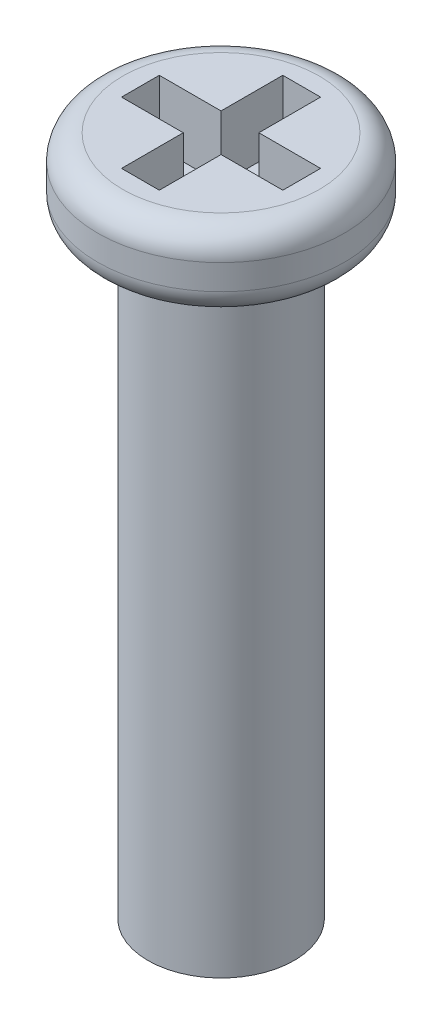
ISO-10303-21;
HEADER;
FILE_DESCRIPTION(('STEP AP214'),'2;1');
FILE_NAME('part.step','',(''),(''),'','','');
FILE_SCHEMA(('AUTOMOTIVE_DESIGN { 1 0 10303 214 1 1 1 1 }'));
ENDSEC;
DATA;
#1=APPLICATION_CONTEXT('core data for automotive mechanical design processes');
#2=APPLICATION_PROTOCOL_DEFINITION('international standard','automotive_design',2000,#1);
#3=PRODUCT_CONTEXT('',#1,'mechanical');
#4=PRODUCT('Part','Part','',(#3));
#5=PRODUCT_RELATED_PRODUCT_CATEGORY('part','',(#4));
#6=PRODUCT_DEFINITION_FORMATION('','',#4);
#7=PRODUCT_DEFINITION_CONTEXT('part definition',#1,'design');
#8=PRODUCT_DEFINITION('design','',#6,#7);
#9=PRODUCT_DEFINITION_SHAPE('','',#8);
#10=(LENGTH_UNIT() NAMED_UNIT(*) SI_UNIT(.MILLI.,.METRE.));
#11=(NAMED_UNIT(*) PLANE_ANGLE_UNIT() SI_UNIT($,.RADIAN.));
#12=(NAMED_UNIT(*) SI_UNIT($,.STERADIAN.) SOLID_ANGLE_UNIT());
#13=UNCERTAINTY_MEASURE_WITH_UNIT(LENGTH_MEASURE(1.E-05),#10,'distance_accuracy_value','');
#14=(GEOMETRIC_REPRESENTATION_CONTEXT(3) GLOBAL_UNCERTAINTY_ASSIGNED_CONTEXT((#13)) GLOBAL_UNIT_ASSIGNED_CONTEXT((#10,
#11,#12)) REPRESENTATION_CONTEXT('',''));
#15=CARTESIAN_POINT('',(0.,0.,0.));
#16=DIRECTION('',(0.,0.,1.));
#17=DIRECTION('',(1.,0.,0.));
#18=AXIS2_PLACEMENT_3D('',#15,#16,#17);
#19=CARTESIAN_POINT('',(0.,12.,0.));
#20=DIRECTION('',(0.,-1.,0.));
#21=DIRECTION('',(0.,0.,-1.));
#22=AXIS2_PLACEMENT_3D('',#19,#20,#21);
#23=CYLINDRICAL_SURFACE('',#22,1.45);
#24=CARTESIAN_POINT('',(0.,12.,0.));
#25=DIRECTION('',(0.,1.,0.));
#26=DIRECTION('',(0.,0.,1.));
#27=AXIS2_PLACEMENT_3D('',#24,#25,#26);
#28=CIRCLE('',#27,1.45);
#29=CARTESIAN_POINT('',(0.,12.,1.45));
#30=VERTEX_POINT('',#29);
#31=EDGE_CURVE('E178',#30,#30,#28,.T.);
#32=ORIENTED_EDGE('',*,*,#31,.F.);
#33=EDGE_LOOP('',(#32));
#34=FACE_BOUND('',#33,.T.);
#35=CARTESIAN_POINT('',(0.,0.,0.));
#36=DIRECTION('',(0.,1.,0.));
#37=DIRECTION('',(0.,0.,1.));
#38=AXIS2_PLACEMENT_3D('',#35,#36,#37);
#39=CIRCLE('',#38,1.45);
#40=CARTESIAN_POINT('',(0.,0.,1.45));
#41=VERTEX_POINT('',#40);
#42=EDGE_CURVE('E182',#41,#41,#39,.T.);
#43=ORIENTED_EDGE('',*,*,#42,.T.);
#44=EDGE_LOOP('',(#43));
#45=FACE_BOUND('',#44,.T.);
#46=ADVANCED_FACE('F32',(#34,#45),#23,.T.);
#47=CARTESIAN_POINT('',(0.,0.,0.));
#48=DIRECTION('',(0.,1.,0.));
#49=DIRECTION('',(0.,0.,1.));
#50=AXIS2_PLACEMENT_3D('',#47,#48,#49);
#51=PLANE('',#50);
#52=ORIENTED_EDGE('',*,*,#42,.F.);
#53=EDGE_LOOP('',(#52));
#54=FACE_BOUND('',#53,.T.);
#55=ADVANCED_FACE('F350',(#54),#51,.F.);
#56=CARTESIAN_POINT('',(0.,12.,0.));
#57=DIRECTION('',(0.,1.,0.));
#58=DIRECTION('',(0.,0.,1.));
#59=AXIS2_PLACEMENT_3D('',#56,#57,#58);
#60=PLANE('',#59);
#61=CARTESIAN_POINT('',(0.,12.,0.));
#62=DIRECTION('',(0.,1.,0.));
#63=DIRECTION('',(0.,0.,1.));
#64=AXIS2_PLACEMENT_3D('',#61,#62,#63);
#65=CIRCLE('',#64,1.95);
#66=CARTESIAN_POINT('',(0.,12.,1.95));
#67=VERTEX_POINT('',#66);
#68=EDGE_CURVE('E191',#67,#67,#65,.F.);
#69=ORIENTED_EDGE('',*,*,#68,.T.);
#70=EDGE_LOOP('',(#69));
#71=FACE_BOUND('',#70,.T.);
#72=ORIENTED_EDGE('',*,*,#31,.T.);
#73=EDGE_LOOP('',(#72));
#74=FACE_BOUND('',#73,.T.);
#75=ADVANCED_FACE('F356',(#71,#74),#60,.F.);
#76=CARTESIAN_POINT('',(0.,13.5,0.));
#77=DIRECTION('',(0.,-1.,0.));
#78=DIRECTION('',(0.,0.,-1.));
#79=AXIS2_PLACEMENT_3D('',#76,#77,#78);
#80=CYLINDRICAL_SURFACE('',#79,2.45);
#81=CARTESIAN_POINT('',(0.,12.5,0.));
#82=DIRECTION('',(0.,1.,0.));
#83=DIRECTION('',(0.,0.,1.));
#84=AXIS2_PLACEMENT_3D('',#81,#82,#83);
#85=CIRCLE('',#84,2.45);
#86=CARTESIAN_POINT('',(0.,12.5,2.45));
#87=VERTEX_POINT('',#86);
#88=EDGE_CURVE('E188',#87,#87,#85,.T.);
#89=ORIENTED_EDGE('',*,*,#88,.T.);
#90=EDGE_LOOP('',(#89));
#91=FACE_BOUND('',#90,.T.);
#92=CARTESIAN_POINT('',(0.,13.,0.));
#93=DIRECTION('',(0.,1.,0.));
#94=DIRECTION('',(0.,0.,1.));
#95=AXIS2_PLACEMENT_3D('',#92,#93,#94);
#96=CIRCLE('',#95,2.45);
#97=CARTESIAN_POINT('',(0.,13.,2.45));
#98=VERTEX_POINT('',#97);
#99=EDGE_CURVE('E181',#98,#98,#96,.F.);
#100=ORIENTED_EDGE('',*,*,#99,.T.);
#101=EDGE_LOOP('',(#100));
#102=FACE_BOUND('',#101,.T.);
#103=ADVANCED_FACE('F506',(#91,#102),#80,.T.);
#104=CARTESIAN_POINT('',(0.,13.5,0.));
#105=DIRECTION('',(0.,1.,0.));
#106=DIRECTION('',(0.,0.,1.));
#107=AXIS2_PLACEMENT_3D('',#104,#105,#106);
#108=PLANE('',#107);
#109=DIRECTION('',(0.,0.,1.));
#110=VECTOR('',#109,1.);
#111=CARTESIAN_POINT('',(-0.375,13.5,0.));
#112=LINE('',#111,#110);
#113=CARTESIAN_POINT('',(-0.375,13.5,-1.6));
#114=VERTEX_POINT('',#113);
#115=CARTESIAN_POINT('',(-0.375,13.5,-0.375));
#116=VERTEX_POINT('',#115);
#117=EDGE_CURVE('E168',#114,#116,#112,.T.);
#118=ORIENTED_EDGE('',*,*,#117,.F.);
#119=DIRECTION('',(1.,0.,0.));
#120=VECTOR('',#119,1.);
#121=CARTESIAN_POINT('',(0.,13.5,-1.6));
#122=LINE('',#121,#120);
#123=CARTESIAN_POINT('',(0.375,13.5,-1.6));
#124=VERTEX_POINT('',#123);
#125=EDGE_CURVE('E164',#114,#124,#122,.T.);
#126=ORIENTED_EDGE('',*,*,#125,.T.);
#127=DIRECTION('',(0.,0.,1.));
#128=VECTOR('',#127,1.);
#129=CARTESIAN_POINT('',(0.375,13.5,0.));
#130=LINE('',#129,#128);
#131=CARTESIAN_POINT('',(0.375,13.5,-0.375));
#132=VERTEX_POINT('',#131);
#133=EDGE_CURVE('E295',#124,#132,#130,.T.);
#134=ORIENTED_EDGE('',*,*,#133,.T.);
#135=DIRECTION('',(1.,0.,0.));
#136=VECTOR('',#135,1.);
#137=CARTESIAN_POINT('',(0.,13.5,-0.375));
#138=LINE('',#137,#136);
#139=CARTESIAN_POINT('',(1.6,13.5,-0.375));
#140=VERTEX_POINT('',#139);
#141=EDGE_CURVE('E293',#132,#140,#138,.T.);
#142=ORIENTED_EDGE('',*,*,#141,.T.);
#143=DIRECTION('',(0.,0.,1.));
#144=VECTOR('',#143,1.);
#145=CARTESIAN_POINT('',(1.6,13.5,0.));
#146=LINE('',#145,#144);
#147=CARTESIAN_POINT('',(1.6,13.5,0.375));
#148=VERTEX_POINT('',#147);
#149=EDGE_CURVE('E290',#140,#148,#146,.T.);
#150=ORIENTED_EDGE('',*,*,#149,.T.);
#151=DIRECTION('',(1.,0.,0.));
#152=VECTOR('',#151,1.);
#153=CARTESIAN_POINT('',(0.,13.5,0.375));
#154=LINE('',#153,#152);
#155=CARTESIAN_POINT('',(0.375,13.5,0.375));
#156=VERTEX_POINT('',#155);
#157=EDGE_CURVE('E287',#156,#148,#154,.T.);
#158=ORIENTED_EDGE('',*,*,#157,.F.);
#159=DIRECTION('',(0.,0.,1.));
#160=VECTOR('',#159,1.);
#161=CARTESIAN_POINT('',(0.375,13.5,0.));
#162=LINE('',#161,#160);
#163=CARTESIAN_POINT('',(0.375,13.5,1.6));
#164=VERTEX_POINT('',#163);
#165=EDGE_CURVE('E284',#156,#164,#162,.T.);
#166=ORIENTED_EDGE('',*,*,#165,.T.);
#167=DIRECTION('',(1.,0.,0.));
#168=VECTOR('',#167,1.);
#169=CARTESIAN_POINT('',(0.,13.5,1.6));
#170=LINE('',#169,#168);
#171=CARTESIAN_POINT('',(-0.375,13.5,1.6));
#172=VERTEX_POINT('',#171);
#173=EDGE_CURVE('E278',#172,#164,#170,.T.);
#174=ORIENTED_EDGE('',*,*,#173,.F.);
#175=DIRECTION('',(0.,0.,1.));
#176=VECTOR('',#175,1.);
#177=CARTESIAN_POINT('',(-0.375,13.5,0.));
#178=LINE('',#177,#176);
#179=CARTESIAN_POINT('',(-0.375,13.5,0.375));
#180=VERTEX_POINT('',#179);
#181=EDGE_CURVE('E276',#180,#172,#178,.T.);
#182=ORIENTED_EDGE('',*,*,#181,.F.);
#183=DIRECTION('',(1.,0.,0.));
#184=VECTOR('',#183,1.);
#185=CARTESIAN_POINT('',(0.,13.5,0.375));
#186=LINE('',#185,#184);
#187=CARTESIAN_POINT('',(-1.6,13.5,0.375));
#188=VERTEX_POINT('',#187);
#189=EDGE_CURVE('E262',#188,#180,#186,.T.);
#190=ORIENTED_EDGE('',*,*,#189,.F.);
#191=DIRECTION('',(0.,0.,1.));
#192=VECTOR('',#191,1.);
#193=CARTESIAN_POINT('',(-1.6,13.5,0.));
#194=LINE('',#193,#192);
#195=CARTESIAN_POINT('',(-1.6,13.5,-0.375));
#196=VERTEX_POINT('',#195);
#197=EDGE_CURVE('E267',#196,#188,#194,.T.);
#198=ORIENTED_EDGE('',*,*,#197,.F.);
#199=DIRECTION('',(1.,0.,0.));
#200=VECTOR('',#199,1.);
#201=CARTESIAN_POINT('',(0.,13.5,-0.375));
#202=LINE('',#201,#200);
#203=EDGE_CURVE('E270',#196,#116,#202,.T.);
#204=ORIENTED_EDGE('',*,*,#203,.T.);
#205=EDGE_LOOP('',(#118,#126,#134,#142,#150,#158,#166,#174,#182,#190,#198,#204));
#206=FACE_BOUND('',#205,.T.);
#207=CARTESIAN_POINT('',(0.,13.5,0.));
#208=DIRECTION('',(0.,1.,0.));
#209=DIRECTION('',(0.,0.,1.));
#210=AXIS2_PLACEMENT_3D('',#207,#208,#209);
#211=CIRCLE('',#210,1.95);
#212=CARTESIAN_POINT('',(0.,13.5,1.95));
#213=VERTEX_POINT('',#212);
#214=EDGE_CURVE('E194',#213,#213,#211,.T.);
#215=ORIENTED_EDGE('',*,*,#214,.T.);
#216=EDGE_LOOP('',(#215));
#217=FACE_BOUND('',#216,.T.);
#218=ADVANCED_FACE('F272',(#206,#217),#108,.T.);
#219=CARTESIAN_POINT('',(0.,12.5,0.));
#220=DIRECTION('',(0.,1.,0.));
#221=DIRECTION('',(0.,0.,1.));
#222=AXIS2_PLACEMENT_3D('',#219,#220,#221);
#223=TOROIDAL_SURFACE('',#222,1.95,0.5);
#224=ORIENTED_EDGE('',*,*,#68,.F.);
#225=EDGE_LOOP('',(#224));
#226=FACE_BOUND('',#225,.T.);
#227=ORIENTED_EDGE('',*,*,#88,.F.);
#228=EDGE_LOOP('',(#227));
#229=FACE_BOUND('',#228,.T.);
#230=ADVANCED_FACE('F363',(#226,#229),#223,.T.);
#231=CARTESIAN_POINT('',(0.,13.,0.));
#232=DIRECTION('',(0.,1.,0.));
#233=DIRECTION('',(0.,0.,1.));
#234=AXIS2_PLACEMENT_3D('',#231,#232,#233);
#235=TOROIDAL_SURFACE('',#234,1.95,0.5);
#236=ORIENTED_EDGE('',*,*,#99,.F.);
#237=EDGE_LOOP('',(#236));
#238=FACE_BOUND('',#237,.T.);
#239=ORIENTED_EDGE('',*,*,#214,.F.);
#240=EDGE_LOOP('',(#239));
#241=FACE_BOUND('',#240,.T.);
#242=ADVANCED_FACE('F366',(#238,#241),#235,.T.);
#243=CARTESIAN_POINT('',(-0.375,12.25,0.));
#244=DIRECTION('',(-1.,0.,0.));
#245=DIRECTION('',(0.,0.,1.));
#246=AXIS2_PLACEMENT_3D('',#243,#244,#245);
#247=PLANE('',#246);
#248=DIRECTION('',(0.,0.,1.));
#249=VECTOR('',#248,1.);
#250=CARTESIAN_POINT('',(-0.375,12.25,0.));
#251=LINE('',#250,#249);
#252=CARTESIAN_POINT('',(-0.375,12.25,-1.1));
#253=VERTEX_POINT('',#252);
#254=CARTESIAN_POINT('',(-0.375,12.25,-0.375));
#255=VERTEX_POINT('',#254);
#256=EDGE_CURVE('E158',#253,#255,#251,.T.);
#257=ORIENTED_EDGE('',*,*,#256,.F.);
#258=CARTESIAN_POINT('',(-0.375,12.75,-1.1));
#259=DIRECTION('',(-1.,0.,0.));
#260=DIRECTION('',(0.,0.,1.));
#261=AXIS2_PLACEMENT_3D('',#258,#259,#260);
#262=CIRCLE('',#261,0.5);
#263=CARTESIAN_POINT('',(-0.375,12.75,-1.6));
#264=VERTEX_POINT('',#263);
#265=EDGE_CURVE('E11',#253,#264,#262,.F.);
#266=ORIENTED_EDGE('',*,*,#265,.T.);
#267=DIRECTION('',(0.,1.,0.));
#268=VECTOR('',#267,1.);
#269=CARTESIAN_POINT('',(-0.375,12.25,-1.6));
#270=LINE('',#269,#268);
#271=EDGE_CURVE('E185',#264,#114,#270,.T.);
#272=ORIENTED_EDGE('',*,*,#271,.T.);
#273=ORIENTED_EDGE('',*,*,#117,.T.);
#274=DIRECTION('',(0.,1.,0.));
#275=VECTOR('',#274,1.);
#276=CARTESIAN_POINT('',(-0.375,12.25,-0.375));
#277=LINE('',#276,#275);
#278=EDGE_CURVE('E150',#255,#116,#277,.T.);
#279=ORIENTED_EDGE('',*,*,#278,.F.);
#280=EDGE_LOOP('',(#257,#266,#272,#273,#279));
#281=FACE_BOUND('',#280,.T.);
#282=ADVANCED_FACE('F166',(#281),#247,.F.);
#283=CARTESIAN_POINT('',(0.,12.25,-1.6));
#284=DIRECTION('',(0.,0.,1.));
#285=DIRECTION('',(1.,0.,0.));
#286=AXIS2_PLACEMENT_3D('',#283,#284,#285);
#287=PLANE('',#286);
#288=ORIENTED_EDGE('',*,*,#271,.F.);
#289=DIRECTION('',(1.,0.,0.));
#290=VECTOR('',#289,1.);
#291=CARTESIAN_POINT('',(0.375,12.75,-1.6));
#292=LINE('',#291,#290);
#293=CARTESIAN_POINT('',(0.375,12.75,-1.6));
#294=VERTEX_POINT('',#293);
#295=EDGE_CURVE('E223',#264,#294,#292,.T.);
#296=ORIENTED_EDGE('',*,*,#295,.T.);
#297=DIRECTION('',(0.,1.,0.));
#298=VECTOR('',#297,1.);
#299=CARTESIAN_POINT('',(0.375,12.25,-1.6));
#300=LINE('',#299,#298);
#301=EDGE_CURVE('E229',#294,#124,#300,.T.);
#302=ORIENTED_EDGE('',*,*,#301,.T.);
#303=ORIENTED_EDGE('',*,*,#125,.F.);
#304=EDGE_LOOP('',(#288,#296,#302,#303));
#305=FACE_BOUND('',#304,.T.);
#306=ADVANCED_FACE('F233',(#305),#287,.T.);
#307=CARTESIAN_POINT('',(0.375,12.25,0.));
#308=DIRECTION('',(-1.,0.,0.));
#309=DIRECTION('',(0.,0.,1.));
#310=AXIS2_PLACEMENT_3D('',#307,#308,#309);
#311=PLANE('',#310);
#312=ORIENTED_EDGE('',*,*,#301,.F.);
#313=CARTESIAN_POINT('',(0.375,12.75,-1.1));
#314=DIRECTION('',(-1.,0.,0.));
#315=DIRECTION('',(0.,0.,1.));
#316=AXIS2_PLACEMENT_3D('',#313,#314,#315);
#317=CIRCLE('',#316,0.5);
#318=CARTESIAN_POINT('',(0.375,12.25,-1.1));
#319=VERTEX_POINT('',#318);
#320=EDGE_CURVE('E40',#294,#319,#317,.T.);
#321=ORIENTED_EDGE('',*,*,#320,.T.);
#322=DIRECTION('',(0.,0.,1.));
#323=VECTOR('',#322,1.);
#324=CARTESIAN_POINT('',(0.375,12.25,0.));
#325=LINE('',#324,#323);
#326=CARTESIAN_POINT('',(0.375,12.25,-0.375));
#327=VERTEX_POINT('',#326);
#328=EDGE_CURVE('E170',#319,#327,#325,.T.);
#329=ORIENTED_EDGE('',*,*,#328,.T.);
#330=DIRECTION('',(0.,1.,0.));
#331=VECTOR('',#330,1.);
#332=CARTESIAN_POINT('',(0.375,12.25,-0.375));
#333=LINE('',#332,#331);
#334=EDGE_CURVE('E237',#327,#132,#333,.T.);
#335=ORIENTED_EDGE('',*,*,#334,.T.);
#336=ORIENTED_EDGE('',*,*,#133,.F.);
#337=EDGE_LOOP('',(#312,#321,#329,#335,#336));
#338=FACE_BOUND('',#337,.T.);
#339=ADVANCED_FACE('F226',(#338),#311,.T.);
#340=CARTESIAN_POINT('',(0.,12.25,-0.375));
#341=DIRECTION('',(0.,0.,1.));
#342=DIRECTION('',(1.,0.,0.));
#343=AXIS2_PLACEMENT_3D('',#340,#341,#342);
#344=PLANE('',#343);
#345=DIRECTION('',(1.,0.,0.));
#346=VECTOR('',#345,1.);
#347=CARTESIAN_POINT('',(0.,12.25,-0.375));
#348=LINE('',#347,#346);
#349=CARTESIAN_POINT('',(1.1,12.25,-0.375));
#350=VERTEX_POINT('',#349);
#351=EDGE_CURVE('E174',#327,#350,#348,.T.);
#352=ORIENTED_EDGE('',*,*,#351,.T.);
#353=CARTESIAN_POINT('',(1.1,12.75,-0.375));
#354=DIRECTION('',(0.,0.,1.));
#355=DIRECTION('',(1.,0.,0.));
#356=AXIS2_PLACEMENT_3D('',#353,#354,#355);
#357=CIRCLE('',#356,0.5);
#358=CARTESIAN_POINT('',(1.6,12.75,-0.375));
#359=VERTEX_POINT('',#358);
#360=EDGE_CURVE('E216',#350,#359,#357,.T.);
#361=ORIENTED_EDGE('',*,*,#360,.T.);
#362=DIRECTION('',(0.,1.,0.));
#363=VECTOR('',#362,1.);
#364=CARTESIAN_POINT('',(1.6,12.25,-0.375));
#365=LINE('',#364,#363);
#366=EDGE_CURVE('E243',#359,#140,#365,.T.);
#367=ORIENTED_EDGE('',*,*,#366,.T.);
#368=ORIENTED_EDGE('',*,*,#141,.F.);
#369=ORIENTED_EDGE('',*,*,#334,.F.);
#370=EDGE_LOOP('',(#352,#361,#367,#368,#369));
#371=FACE_BOUND('',#370,.T.);
#372=ADVANCED_FACE('F334',(#371),#344,.T.);
#373=CARTESIAN_POINT('',(1.6,12.25,0.));
#374=DIRECTION('',(-1.,0.,0.));
#375=DIRECTION('',(0.,0.,1.));
#376=AXIS2_PLACEMENT_3D('',#373,#374,#375);
#377=PLANE('',#376);
#378=ORIENTED_EDGE('',*,*,#366,.F.);
#379=DIRECTION('',(0.,0.,1.));
#380=VECTOR('',#379,1.);
#381=CARTESIAN_POINT('',(1.6,12.75,0.375));
#382=LINE('',#381,#380);
#383=CARTESIAN_POINT('',(1.6,12.75,0.375));
#384=VERTEX_POINT('',#383);
#385=EDGE_CURVE('E211',#359,#384,#382,.T.);
#386=ORIENTED_EDGE('',*,*,#385,.T.);
#387=DIRECTION('',(0.,1.,0.));
#388=VECTOR('',#387,1.);
#389=CARTESIAN_POINT('',(1.6,12.25,0.375));
#390=LINE('',#389,#388);
#391=EDGE_CURVE('E245',#384,#148,#390,.T.);
#392=ORIENTED_EDGE('',*,*,#391,.T.);
#393=ORIENTED_EDGE('',*,*,#149,.F.);
#394=EDGE_LOOP('',(#378,#386,#392,#393));
#395=FACE_BOUND('',#394,.T.);
#396=ADVANCED_FACE('F338',(#395),#377,.T.);
#397=CARTESIAN_POINT('',(0.,12.25,0.375));
#398=DIRECTION('',(0.,0.,1.));
#399=DIRECTION('',(1.,0.,0.));
#400=AXIS2_PLACEMENT_3D('',#397,#398,#399);
#401=PLANE('',#400);
#402=ORIENTED_EDGE('',*,*,#391,.F.);
#403=CARTESIAN_POINT('',(1.1,12.75,0.375));
#404=DIRECTION('',(0.,0.,1.));
#405=DIRECTION('',(1.,0.,0.));
#406=AXIS2_PLACEMENT_3D('',#403,#404,#405);
#407=CIRCLE('',#406,0.5);
#408=CARTESIAN_POINT('',(1.1,12.25,0.375));
#409=VERTEX_POINT('',#408);
#410=EDGE_CURVE('E214',#384,#409,#407,.F.);
#411=ORIENTED_EDGE('',*,*,#410,.T.);
#412=DIRECTION('',(1.,0.,0.));
#413=VECTOR('',#412,1.);
#414=CARTESIAN_POINT('',(0.,12.25,0.375));
#415=LINE('',#414,#413);
#416=CARTESIAN_POINT('',(0.375,12.25,0.375));
#417=VERTEX_POINT('',#416);
#418=EDGE_CURVE('E300',#417,#409,#415,.T.);
#419=ORIENTED_EDGE('',*,*,#418,.F.);
#420=DIRECTION('',(0.,1.,0.));
#421=VECTOR('',#420,1.);
#422=CARTESIAN_POINT('',(0.375,12.25,0.375));
#423=LINE('',#422,#421);
#424=EDGE_CURVE('E247',#417,#156,#423,.T.);
#425=ORIENTED_EDGE('',*,*,#424,.T.);
#426=ORIENTED_EDGE('',*,*,#157,.T.);
#427=EDGE_LOOP('',(#402,#411,#419,#425,#426));
#428=FACE_BOUND('',#427,.T.);
#429=ADVANCED_FACE('F326',(#428),#401,.F.);
#430=CARTESIAN_POINT('',(0.375,12.25,0.));
#431=DIRECTION('',(-1.,0.,0.));
#432=DIRECTION('',(0.,0.,1.));
#433=AXIS2_PLACEMENT_3D('',#430,#431,#432);
#434=PLANE('',#433);
#435=DIRECTION('',(0.,0.,1.));
#436=VECTOR('',#435,1.);
#437=CARTESIAN_POINT('',(0.375,12.25,0.));
#438=LINE('',#437,#436);
#439=CARTESIAN_POINT('',(0.375,12.25,1.1));
#440=VERTEX_POINT('',#439);
#441=EDGE_CURVE('E303',#417,#440,#438,.T.);
#442=ORIENTED_EDGE('',*,*,#441,.T.);
#443=CARTESIAN_POINT('',(0.375,12.75,1.1));
#444=DIRECTION('',(-1.,0.,0.));
#445=DIRECTION('',(0.,0.,1.));
#446=AXIS2_PLACEMENT_3D('',#443,#444,#445);
#447=CIRCLE('',#446,0.5);
#448=CARTESIAN_POINT('',(0.375,12.75,1.6));
#449=VERTEX_POINT('',#448);
#450=EDGE_CURVE('E205',#440,#449,#447,.T.);
#451=ORIENTED_EDGE('',*,*,#450,.T.);
#452=DIRECTION('',(0.,1.,0.));
#453=VECTOR('',#452,1.);
#454=CARTESIAN_POINT('',(0.375,12.25,1.6));
#455=LINE('',#454,#453);
#456=EDGE_CURVE('E249',#449,#164,#455,.T.);
#457=ORIENTED_EDGE('',*,*,#456,.T.);
#458=ORIENTED_EDGE('',*,*,#165,.F.);
#459=ORIENTED_EDGE('',*,*,#424,.F.);
#460=EDGE_LOOP('',(#442,#451,#457,#458,#459));
#461=FACE_BOUND('',#460,.T.);
#462=ADVANCED_FACE('F320',(#461),#434,.T.);
#463=CARTESIAN_POINT('',(0.,12.25,1.6));
#464=DIRECTION('',(0.,0.,1.));
#465=DIRECTION('',(1.,0.,0.));
#466=AXIS2_PLACEMENT_3D('',#463,#464,#465);
#467=PLANE('',#466);
#468=ORIENTED_EDGE('',*,*,#456,.F.);
#469=DIRECTION('',(1.,0.,0.));
#470=VECTOR('',#469,1.);
#471=CARTESIAN_POINT('',(0.,12.75,1.6));
#472=LINE('',#471,#470);
#473=CARTESIAN_POINT('',(-0.375,12.75,1.6));
#474=VERTEX_POINT('',#473);
#475=EDGE_CURVE('E207',#449,#474,#472,.F.);
#476=ORIENTED_EDGE('',*,*,#475,.T.);
#477=DIRECTION('',(0.,1.,0.));
#478=VECTOR('',#477,1.);
#479=CARTESIAN_POINT('',(-0.375,12.25,1.6));
#480=LINE('',#479,#478);
#481=EDGE_CURVE('E251',#474,#172,#480,.T.);
#482=ORIENTED_EDGE('',*,*,#481,.T.);
#483=ORIENTED_EDGE('',*,*,#173,.T.);
#484=EDGE_LOOP('',(#468,#476,#482,#483));
#485=FACE_BOUND('',#484,.T.);
#486=ADVANCED_FACE('F340',(#485),#467,.F.);
#487=CARTESIAN_POINT('',(-0.375,12.25,0.));
#488=DIRECTION('',(-1.,0.,0.));
#489=DIRECTION('',(0.,0.,1.));
#490=AXIS2_PLACEMENT_3D('',#487,#488,#489);
#491=PLANE('',#490);
#492=ORIENTED_EDGE('',*,*,#481,.F.);
#493=CARTESIAN_POINT('',(-0.375,12.75,1.1));
#494=DIRECTION('',(-1.,0.,0.));
#495=DIRECTION('',(0.,0.,1.));
#496=AXIS2_PLACEMENT_3D('',#493,#494,#495);
#497=CIRCLE('',#496,0.5);
#498=CARTESIAN_POINT('',(-0.375,12.25,1.1));
#499=VERTEX_POINT('',#498);
#500=EDGE_CURVE('E209',#474,#499,#497,.F.);
#501=ORIENTED_EDGE('',*,*,#500,.T.);
#502=DIRECTION('',(0.,0.,1.));
#503=VECTOR('',#502,1.);
#504=CARTESIAN_POINT('',(-0.375,12.25,0.));
#505=LINE('',#504,#503);
#506=CARTESIAN_POINT('',(-0.375,12.25,0.375));
#507=VERTEX_POINT('',#506);
#508=EDGE_CURVE('E306',#507,#499,#505,.T.);
#509=ORIENTED_EDGE('',*,*,#508,.F.);
#510=DIRECTION('',(0.,1.,0.));
#511=VECTOR('',#510,1.);
#512=CARTESIAN_POINT('',(-0.375,12.25,0.375));
#513=LINE('',#512,#511);
#514=EDGE_CURVE('E253',#507,#180,#513,.T.);
#515=ORIENTED_EDGE('',*,*,#514,.T.);
#516=ORIENTED_EDGE('',*,*,#181,.T.);
#517=EDGE_LOOP('',(#492,#501,#509,#515,#516));
#518=FACE_BOUND('',#517,.T.);
#519=ADVANCED_FACE('F312',(#518),#491,.F.);
#520=CARTESIAN_POINT('',(0.,12.25,0.375));
#521=DIRECTION('',(0.,0.,1.));
#522=DIRECTION('',(1.,0.,0.));
#523=AXIS2_PLACEMENT_3D('',#520,#521,#522);
#524=PLANE('',#523);
#525=DIRECTION('',(1.,0.,0.));
#526=VECTOR('',#525,1.);
#527=CARTESIAN_POINT('',(0.,12.25,0.375));
#528=LINE('',#527,#526);
#529=CARTESIAN_POINT('',(-1.1,12.25,0.375));
#530=VERTEX_POINT('',#529);
#531=EDGE_CURVE('E157',#530,#507,#528,.T.);
#532=ORIENTED_EDGE('',*,*,#531,.F.);
#533=CARTESIAN_POINT('',(-1.1,12.75,0.375));
#534=DIRECTION('',(0.,0.,1.));
#535=DIRECTION('',(1.,0.,0.));
#536=AXIS2_PLACEMENT_3D('',#533,#534,#535);
#537=CIRCLE('',#536,0.5);
#538=CARTESIAN_POINT('',(-1.6,12.75,0.375));
#539=VERTEX_POINT('',#538);
#540=EDGE_CURVE('E218',#530,#539,#537,.F.);
#541=ORIENTED_EDGE('',*,*,#540,.T.);
#542=DIRECTION('',(0.,1.,0.));
#543=VECTOR('',#542,1.);
#544=CARTESIAN_POINT('',(-1.6,12.25,0.375));
#545=LINE('',#544,#543);
#546=EDGE_CURVE('E172',#539,#188,#545,.T.);
#547=ORIENTED_EDGE('',*,*,#546,.T.);
#548=ORIENTED_EDGE('',*,*,#189,.T.);
#549=ORIENTED_EDGE('',*,*,#514,.F.);
#550=EDGE_LOOP('',(#532,#541,#547,#548,#549));
#551=FACE_BOUND('',#550,.T.);
#552=ADVANCED_FACE('F259',(#551),#524,.F.);
#553=CARTESIAN_POINT('',(-1.6,12.25,0.));
#554=DIRECTION('',(-1.,0.,0.));
#555=DIRECTION('',(0.,0.,1.));
#556=AXIS2_PLACEMENT_3D('',#553,#554,#555);
#557=PLANE('',#556);
#558=ORIENTED_EDGE('',*,*,#546,.F.);
#559=DIRECTION('',(0.,0.,1.));
#560=VECTOR('',#559,1.);
#561=CARTESIAN_POINT('',(-1.6,12.75,0.));
#562=LINE('',#561,#560);
#563=CARTESIAN_POINT('',(-1.6,12.75,-0.375));
#564=VERTEX_POINT('',#563);
#565=EDGE_CURVE('E220',#539,#564,#562,.F.);
#566=ORIENTED_EDGE('',*,*,#565,.T.);
#567=DIRECTION('',(0.,1.,0.));
#568=VECTOR('',#567,1.);
#569=CARTESIAN_POINT('',(-1.6,12.25,-0.375));
#570=LINE('',#569,#568);
#571=EDGE_CURVE('E169',#564,#196,#570,.T.);
#572=ORIENTED_EDGE('',*,*,#571,.T.);
#573=ORIENTED_EDGE('',*,*,#197,.T.);
#574=EDGE_LOOP('',(#558,#566,#572,#573));
#575=FACE_BOUND('',#574,.T.);
#576=ADVANCED_FACE('F268',(#575),#557,.F.);
#577=CARTESIAN_POINT('',(0.,12.25,-0.375));
#578=DIRECTION('',(0.,0.,1.));
#579=DIRECTION('',(1.,0.,0.));
#580=AXIS2_PLACEMENT_3D('',#577,#578,#579);
#581=PLANE('',#580);
#582=ORIENTED_EDGE('',*,*,#571,.F.);
#583=CARTESIAN_POINT('',(-1.1,12.75,-0.375));
#584=DIRECTION('',(0.,0.,1.));
#585=DIRECTION('',(1.,0.,0.));
#586=AXIS2_PLACEMENT_3D('',#583,#584,#585);
#587=CIRCLE('',#586,0.5);
#588=CARTESIAN_POINT('',(-1.1,12.25,-0.375));
#589=VERTEX_POINT('',#588);
#590=EDGE_CURVE('E153',#564,#589,#587,.T.);
#591=ORIENTED_EDGE('',*,*,#590,.T.);
#592=DIRECTION('',(1.,0.,0.));
#593=VECTOR('',#592,1.);
#594=CARTESIAN_POINT('',(0.,12.25,-0.375));
#595=LINE('',#594,#593);
#596=EDGE_CURVE('E144',#589,#255,#595,.T.);
#597=ORIENTED_EDGE('',*,*,#596,.T.);
#598=ORIENTED_EDGE('',*,*,#278,.T.);
#599=ORIENTED_EDGE('',*,*,#203,.F.);
#600=EDGE_LOOP('',(#582,#591,#597,#598,#599));
#601=FACE_BOUND('',#600,.T.);
#602=ADVANCED_FACE('F147',(#601),#581,.T.);
#603=CARTESIAN_POINT('',(0.,12.25,0.));
#604=DIRECTION('',(0.,1.,0.));
#605=DIRECTION('',(0.,0.,1.));
#606=AXIS2_PLACEMENT_3D('',#603,#604,#605);
#607=PLANE('',#606);
#608=ORIENTED_EDGE('',*,*,#508,.T.);
#609=DIRECTION('',(1.,0.,0.));
#610=VECTOR('',#609,1.);
#611=CARTESIAN_POINT('',(0.,12.25,1.1));
#612=LINE('',#611,#610);
#613=EDGE_CURVE('E202',#499,#440,#612,.T.);
#614=ORIENTED_EDGE('',*,*,#613,.T.);
#615=ORIENTED_EDGE('',*,*,#441,.F.);
#616=ORIENTED_EDGE('',*,*,#418,.T.);
#617=DIRECTION('',(0.,0.,1.));
#618=VECTOR('',#617,1.);
#619=CARTESIAN_POINT('',(1.1,12.25,-0.375));
#620=LINE('',#619,#618);
#621=EDGE_CURVE('E200',#409,#350,#620,.F.);
#622=ORIENTED_EDGE('',*,*,#621,.T.);
#623=ORIENTED_EDGE('',*,*,#351,.F.);
#624=ORIENTED_EDGE('',*,*,#328,.F.);
#625=DIRECTION('',(1.,0.,0.));
#626=VECTOR('',#625,1.);
#627=CARTESIAN_POINT('',(-0.375,12.25,-1.1));
#628=LINE('',#627,#626);
#629=EDGE_CURVE('E163',#319,#253,#628,.F.);
#630=ORIENTED_EDGE('',*,*,#629,.T.);
#631=ORIENTED_EDGE('',*,*,#256,.T.);
#632=ORIENTED_EDGE('',*,*,#596,.F.);
#633=DIRECTION('',(0.,0.,1.));
#634=VECTOR('',#633,1.);
#635=CARTESIAN_POINT('',(-1.1,12.25,0.));
#636=LINE('',#635,#634);
#637=EDGE_CURVE('E198',#589,#530,#636,.T.);
#638=ORIENTED_EDGE('',*,*,#637,.T.);
#639=ORIENTED_EDGE('',*,*,#531,.T.);
#640=EDGE_LOOP('',(#608,#614,#615,#616,#622,#623,#624,#630,#631,#632,#638,#639));
#641=FACE_BOUND('',#640,.T.);
#642=ADVANCED_FACE('F161',(#641),#607,.T.);
#643=CARTESIAN_POINT('',(0.,12.75,1.1));
#644=DIRECTION('',(1.,0.,0.));
#645=DIRECTION('',(0.,0.,-1.));
#646=AXIS2_PLACEMENT_3D('',#643,#644,#645);
#647=CYLINDRICAL_SURFACE('',#646,0.5);
#648=ORIENTED_EDGE('',*,*,#500,.F.);
#649=ORIENTED_EDGE('',*,*,#475,.F.);
#650=ORIENTED_EDGE('',*,*,#450,.F.);
#651=ORIENTED_EDGE('',*,*,#613,.F.);
#652=EDGE_LOOP('',(#648,#649,#650,#651));
#653=FACE_BOUND('',#652,.T.);
#654=ADVANCED_FACE('F316',(#653),#647,.F.);
#655=CARTESIAN_POINT('',(1.1,12.75,0.));
#656=DIRECTION('',(0.,0.,-1.));
#657=DIRECTION('',(-1.,0.,0.));
#658=AXIS2_PLACEMENT_3D('',#655,#656,#657);
#659=CYLINDRICAL_SURFACE('',#658,0.5);
#660=ORIENTED_EDGE('',*,*,#360,.F.);
#661=ORIENTED_EDGE('',*,*,#621,.F.);
#662=ORIENTED_EDGE('',*,*,#410,.F.);
#663=ORIENTED_EDGE('',*,*,#385,.F.);
#664=EDGE_LOOP('',(#660,#661,#662,#663));
#665=FACE_BOUND('',#664,.T.);
#666=ADVANCED_FACE('F330',(#665),#659,.F.);
#667=CARTESIAN_POINT('',(-1.1,12.75,0.));
#668=DIRECTION('',(0.,0.,1.));
#669=DIRECTION('',(1.,0.,0.));
#670=AXIS2_PLACEMENT_3D('',#667,#668,#669);
#671=CYLINDRICAL_SURFACE('',#670,0.5);
#672=ORIENTED_EDGE('',*,*,#590,.F.);
#673=ORIENTED_EDGE('',*,*,#565,.F.);
#674=ORIENTED_EDGE('',*,*,#540,.F.);
#675=ORIENTED_EDGE('',*,*,#637,.F.);
#676=EDGE_LOOP('',(#672,#673,#674,#675));
#677=FACE_BOUND('',#676,.T.);
#678=ADVANCED_FACE('F374',(#677),#671,.F.);
#679=CARTESIAN_POINT('',(0.,12.75,-1.1));
#680=DIRECTION('',(-1.,0.,0.));
#681=DIRECTION('',(0.,0.,1.));
#682=AXIS2_PLACEMENT_3D('',#679,#680,#681);
#683=CYLINDRICAL_SURFACE('',#682,0.5);
#684=ORIENTED_EDGE('',*,*,#265,.F.);
#685=ORIENTED_EDGE('',*,*,#629,.F.);
#686=ORIENTED_EDGE('',*,*,#320,.F.);
#687=ORIENTED_EDGE('',*,*,#295,.F.);
#688=EDGE_LOOP('',(#684,#685,#686,#687));
#689=FACE_BOUND('',#688,.T.);
#690=ADVANCED_FACE('F34',(#689),#683,.F.);
#691=CLOSED_SHELL('',(#46,#55,#75,#103,#218,#230,#242,#282,#306,#339,#372,#396,#429,#462,#486,
#519,#552,#576,#602,#642,#654,#666,#678,#690));
#692=MANIFOLD_SOLID_BREP('B2',#691);
#693=ADVANCED_BREP_SHAPE_REPRESENTATION('',(#18,#692),#14);
#694=SHAPE_DEFINITION_REPRESENTATION(#9,#693);
ENDSEC;
END-ISO-10303-21;
